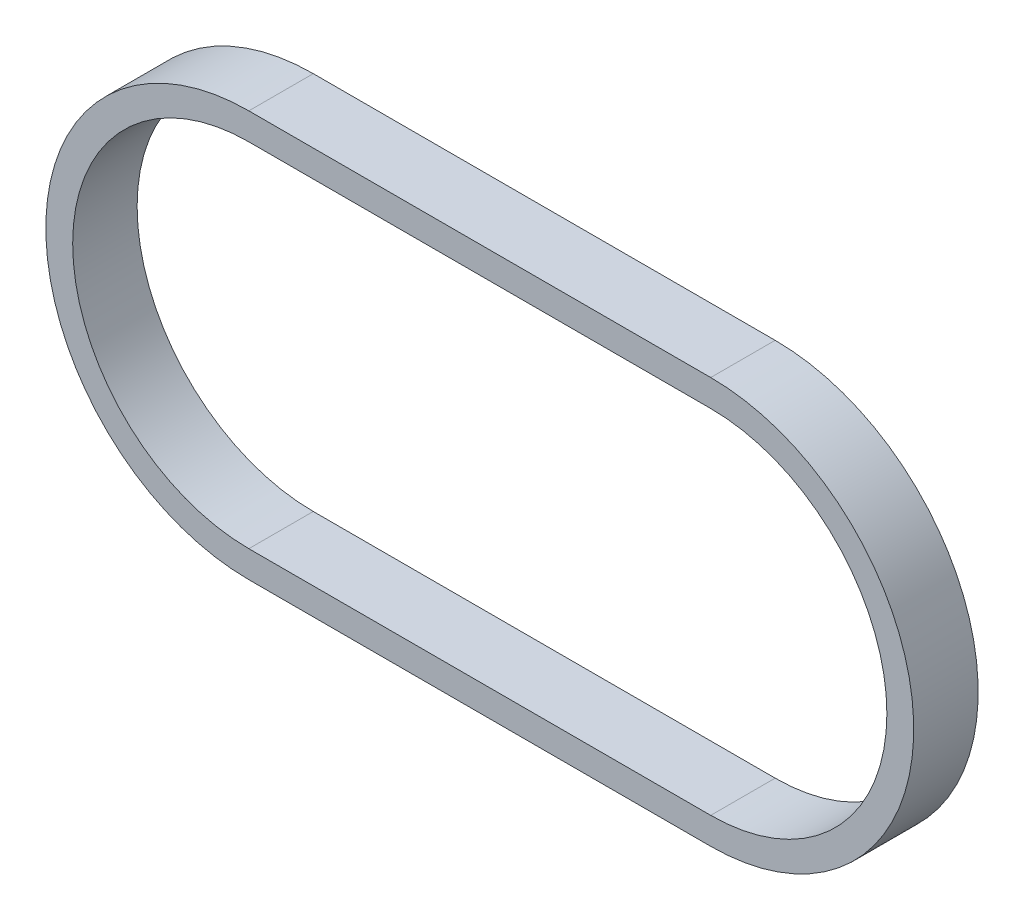
ISO-10303-21;
HEADER;
FILE_DESCRIPTION(('STEP AP214'),'2;1');
FILE_NAME('part.step','',(''),(''),'','','');
FILE_SCHEMA(('AUTOMOTIVE_DESIGN { 1 0 10303 214 1 1 1 1 }'));
ENDSEC;
DATA;
#1=APPLICATION_CONTEXT('core data for automotive mechanical design processes');
#2=APPLICATION_PROTOCOL_DEFINITION('international standard','automotive_design',2000,#1);
#3=PRODUCT_CONTEXT('',#1,'mechanical');
#4=PRODUCT('Part','Part','',(#3));
#5=PRODUCT_RELATED_PRODUCT_CATEGORY('part','',(#4));
#6=PRODUCT_DEFINITION_FORMATION('','',#4);
#7=PRODUCT_DEFINITION_CONTEXT('part definition',#1,'design');
#8=PRODUCT_DEFINITION('design','',#6,#7);
#9=PRODUCT_DEFINITION_SHAPE('','',#8);
#10=(LENGTH_UNIT() NAMED_UNIT(*) SI_UNIT(.MILLI.,.METRE.));
#11=(NAMED_UNIT(*) PLANE_ANGLE_UNIT() SI_UNIT($,.RADIAN.));
#12=(NAMED_UNIT(*) SI_UNIT($,.STERADIAN.) SOLID_ANGLE_UNIT());
#13=UNCERTAINTY_MEASURE_WITH_UNIT(LENGTH_MEASURE(1.E-05),#10,'distance_accuracy_value','');
#14=(GEOMETRIC_REPRESENTATION_CONTEXT(3) GLOBAL_UNCERTAINTY_ASSIGNED_CONTEXT((#13)) GLOBAL_UNIT_ASSIGNED_CONTEXT((#10,
#11,#12)) REPRESENTATION_CONTEXT('',''));
#15=CARTESIAN_POINT('',(0.,0.,0.));
#16=DIRECTION('',(0.,0.,1.));
#17=DIRECTION('',(1.,0.,0.));
#18=AXIS2_PLACEMENT_3D('',#15,#16,#17);
#19=CARTESIAN_POINT('',(-21.5,1.50133697570255E-13,6.));
#20=DIRECTION('',(0.,0.,1.));
#21=DIRECTION('',(1.,0.,0.));
#22=AXIS2_PLACEMENT_3D('',#19,#20,#21);
#23=PLANE('',#22);
#24=CARTESIAN_POINT('',(-21.5,1.50133697570255E-13,6.));
#25=DIRECTION('',(0.,0.,1.));
#26=DIRECTION('',(1.,0.,0.));
#27=AXIS2_PLACEMENT_3D('',#24,#25,#26);
#28=CIRCLE('',#27,18.9000000000001);
#29=CARTESIAN_POINT('',(-21.4999999999999,18.9000000000001,6.));
#30=VERTEX_POINT('',#29);
#31=CARTESIAN_POINT('',(-21.5,-18.9,6.));
#32=VERTEX_POINT('',#31);
#33=EDGE_CURVE('E153',#30,#32,#28,.T.);
#34=ORIENTED_EDGE('',*,*,#33,.T.);
#35=DIRECTION('',(1.,0.,0.));
#36=VECTOR('',#35,1.);
#37=CARTESIAN_POINT('',(-21.5,-18.9,6.));
#38=LINE('',#37,#36);
#39=CARTESIAN_POINT('',(21.5,-18.9,6.));
#40=VERTEX_POINT('',#39);
#41=EDGE_CURVE('E157',#32,#40,#38,.T.);
#42=ORIENTED_EDGE('',*,*,#41,.T.);
#43=CARTESIAN_POINT('',(21.5,0.,6.));
#44=DIRECTION('',(0.,0.,1.));
#45=DIRECTION('',(1.,0.,0.));
#46=AXIS2_PLACEMENT_3D('',#43,#44,#45);
#47=CIRCLE('',#46,18.9);
#48=CARTESIAN_POINT('',(21.5,18.9,6.));
#49=VERTEX_POINT('',#48);
#50=EDGE_CURVE('E161',#40,#49,#47,.T.);
#51=ORIENTED_EDGE('',*,*,#50,.T.);
#52=DIRECTION('',(-1.,0.,0.));
#53=VECTOR('',#52,1.);
#54=CARTESIAN_POINT('',(21.5,18.9,6.));
#55=LINE('',#54,#53);
#56=EDGE_CURVE('E164',#49,#30,#55,.T.);
#57=ORIENTED_EDGE('',*,*,#56,.T.);
#58=EDGE_LOOP('',(#34,#42,#51,#57));
#59=FACE_BOUND('',#58,.T.);
#60=DIRECTION('',(-1.,0.,0.));
#61=VECTOR('',#60,1.);
#62=CARTESIAN_POINT('',(-21.4999999999999,16.4000000000001,6.));
#63=LINE('',#62,#61);
#64=CARTESIAN_POINT('',(21.5,16.4,6.));
#65=VERTEX_POINT('',#64);
#66=CARTESIAN_POINT('',(-21.4999999999999,16.4000000000001,6.));
#67=VERTEX_POINT('',#66);
#68=EDGE_CURVE('E114',#65,#67,#63,.T.);
#69=ORIENTED_EDGE('',*,*,#68,.F.);
#70=CARTESIAN_POINT('',(21.5,0.,6.));
#71=DIRECTION('',(0.,0.,1.));
#72=DIRECTION('',(-1.,0.,0.));
#73=AXIS2_PLACEMENT_3D('',#70,#71,#72);
#74=CIRCLE('',#73,16.4);
#75=CARTESIAN_POINT('',(21.5,-16.4,6.));
#76=VERTEX_POINT('',#75);
#77=EDGE_CURVE('E105',#76,#65,#74,.T.);
#78=ORIENTED_EDGE('',*,*,#77,.F.);
#79=DIRECTION('',(1.,0.,0.));
#80=VECTOR('',#79,1.);
#81=CARTESIAN_POINT('',(21.5,-16.4,6.));
#82=LINE('',#81,#80);
#83=CARTESIAN_POINT('',(-21.5,-16.4,6.));
#84=VERTEX_POINT('',#83);
#85=EDGE_CURVE('E131',#84,#76,#82,.T.);
#86=ORIENTED_EDGE('',*,*,#85,.F.);
#87=CARTESIAN_POINT('',(-21.5,1.50133697570255E-13,6.));
#88=DIRECTION('',(0.,0.,1.));
#89=DIRECTION('',(-1.,0.,0.));
#90=AXIS2_PLACEMENT_3D('',#87,#88,#89);
#91=CIRCLE('',#90,16.4000000000001);
#92=EDGE_CURVE('E127',#67,#84,#91,.T.);
#93=ORIENTED_EDGE('',*,*,#92,.F.);
#94=EDGE_LOOP('',(#69,#78,#86,#93));
#95=FACE_BOUND('',#94,.T.);
#96=ADVANCED_FACE('F39',(#59,#95),#23,.T.);
#97=CARTESIAN_POINT('',(-21.5,1.50133697570255E-13,0.));
#98=DIRECTION('',(0.,0.,1.));
#99=DIRECTION('',(1.,0.,0.));
#100=AXIS2_PLACEMENT_3D('',#97,#98,#99);
#101=PLANE('',#100);
#102=CARTESIAN_POINT('',(-21.5,1.50133697570255E-13,0.));
#103=DIRECTION('',(0.,0.,1.));
#104=DIRECTION('',(1.,0.,0.));
#105=AXIS2_PLACEMENT_3D('',#102,#103,#104);
#106=CIRCLE('',#105,18.9000000000001);
#107=CARTESIAN_POINT('',(-21.4999999999999,18.9000000000001,0.));
#108=VERTEX_POINT('',#107);
#109=CARTESIAN_POINT('',(-21.5,-18.9,0.));
#110=VERTEX_POINT('',#109);
#111=EDGE_CURVE('E123',#108,#110,#106,.T.);
#112=ORIENTED_EDGE('',*,*,#111,.F.);
#113=DIRECTION('',(-1.,0.,0.));
#114=VECTOR('',#113,1.);
#115=CARTESIAN_POINT('',(21.5,18.9,0.));
#116=LINE('',#115,#114);
#117=CARTESIAN_POINT('',(21.5,18.9,0.));
#118=VERTEX_POINT('',#117);
#119=EDGE_CURVE('E158',#118,#108,#116,.T.);
#120=ORIENTED_EDGE('',*,*,#119,.F.);
#121=CARTESIAN_POINT('',(21.5,0.,0.));
#122=DIRECTION('',(0.,0.,1.));
#123=DIRECTION('',(1.,0.,0.));
#124=AXIS2_PLACEMENT_3D('',#121,#122,#123);
#125=CIRCLE('',#124,18.9);
#126=CARTESIAN_POINT('',(21.5,-18.9,0.));
#127=VERTEX_POINT('',#126);
#128=EDGE_CURVE('E174',#127,#118,#125,.T.);
#129=ORIENTED_EDGE('',*,*,#128,.F.);
#130=DIRECTION('',(1.,0.,0.));
#131=VECTOR('',#130,1.);
#132=CARTESIAN_POINT('',(-21.5,-18.9,0.));
#133=LINE('',#132,#131);
#134=EDGE_CURVE('E171',#110,#127,#133,.T.);
#135=ORIENTED_EDGE('',*,*,#134,.F.);
#136=EDGE_LOOP('',(#112,#120,#129,#135));
#137=FACE_BOUND('',#136,.T.);
#138=CARTESIAN_POINT('',(21.5,0.,0.));
#139=DIRECTION('',(0.,0.,1.));
#140=DIRECTION('',(-1.,0.,0.));
#141=AXIS2_PLACEMENT_3D('',#138,#139,#140);
#142=CIRCLE('',#141,16.4);
#143=CARTESIAN_POINT('',(21.5,-16.4,0.));
#144=VERTEX_POINT('',#143);
#145=CARTESIAN_POINT('',(21.5,16.4,0.));
#146=VERTEX_POINT('',#145);
#147=EDGE_CURVE('E63',#144,#146,#142,.T.);
#148=ORIENTED_EDGE('',*,*,#147,.T.);
#149=DIRECTION('',(-1.,0.,0.));
#150=VECTOR('',#149,1.);
#151=CARTESIAN_POINT('',(-21.4999999999999,16.4000000000001,0.));
#152=LINE('',#151,#150);
#153=CARTESIAN_POINT('',(-21.4999999999999,16.4000000000001,0.));
#154=VERTEX_POINT('',#153);
#155=EDGE_CURVE('E121',#146,#154,#152,.T.);
#156=ORIENTED_EDGE('',*,*,#155,.T.);
#157=CARTESIAN_POINT('',(-21.5,1.50133697570255E-13,0.));
#158=DIRECTION('',(0.,0.,1.));
#159=DIRECTION('',(-1.,0.,0.));
#160=AXIS2_PLACEMENT_3D('',#157,#158,#159);
#161=CIRCLE('',#160,16.4000000000001);
#162=CARTESIAN_POINT('',(-21.5,-16.3999999999999,0.));
#163=VERTEX_POINT('',#162);
#164=EDGE_CURVE('E140',#154,#163,#161,.T.);
#165=ORIENTED_EDGE('',*,*,#164,.T.);
#166=DIRECTION('',(1.,0.,0.));
#167=VECTOR('',#166,1.);
#168=CARTESIAN_POINT('',(21.5,-16.4,0.));
#169=LINE('',#168,#167);
#170=EDGE_CURVE('E115',#163,#144,#169,.T.);
#171=ORIENTED_EDGE('',*,*,#170,.T.);
#172=EDGE_LOOP('',(#148,#156,#165,#171));
#173=FACE_BOUND('',#172,.T.);
#174=ADVANCED_FACE('F197',(#137,#173),#101,.F.);
#175=CARTESIAN_POINT('',(-21.5,1.50133697570255E-13,6.));
#176=DIRECTION('',(0.,0.,-1.));
#177=DIRECTION('',(-1.,0.,0.));
#178=AXIS2_PLACEMENT_3D('',#175,#176,#177);
#179=CYLINDRICAL_SURFACE('',#178,18.9000000000001);
#180=ORIENTED_EDGE('',*,*,#111,.T.);
#181=DIRECTION('',(0.,0.,-1.));
#182=VECTOR('',#181,1.);
#183=CARTESIAN_POINT('',(-21.5,-18.9,6.));
#184=LINE('',#183,#182);
#185=EDGE_CURVE('E11',#32,#110,#184,.T.);
#186=ORIENTED_EDGE('',*,*,#185,.F.);
#187=ORIENTED_EDGE('',*,*,#33,.F.);
#188=DIRECTION('',(0.,0.,-1.));
#189=VECTOR('',#188,1.);
#190=CARTESIAN_POINT('',(-21.4999999999999,18.9000000000001,6.));
#191=LINE('',#190,#189);
#192=EDGE_CURVE('E167',#30,#108,#191,.T.);
#193=ORIENTED_EDGE('',*,*,#192,.T.);
#194=EDGE_LOOP('',(#180,#186,#187,#193));
#195=FACE_BOUND('',#194,.T.);
#196=ADVANCED_FACE('F41',(#195),#179,.T.);
#197=CARTESIAN_POINT('',(-21.5,-18.9,6.));
#198=DIRECTION('',(0.,1.,0.));
#199=DIRECTION('',(0.,0.,1.));
#200=AXIS2_PLACEMENT_3D('',#197,#198,#199);
#201=PLANE('',#200);
#202=ORIENTED_EDGE('',*,*,#134,.T.);
#203=DIRECTION('',(0.,0.,-1.));
#204=VECTOR('',#203,1.);
#205=CARTESIAN_POINT('',(21.5,-18.9,6.));
#206=LINE('',#205,#204);
#207=EDGE_CURVE('E48',#40,#127,#206,.T.);
#208=ORIENTED_EDGE('',*,*,#207,.F.);
#209=ORIENTED_EDGE('',*,*,#41,.F.);
#210=ORIENTED_EDGE('',*,*,#185,.T.);
#211=EDGE_LOOP('',(#202,#208,#209,#210));
#212=FACE_BOUND('',#211,.T.);
#213=ADVANCED_FACE('F207',(#212),#201,.F.);
#214=CARTESIAN_POINT('',(21.5,0.,6.));
#215=DIRECTION('',(0.,0.,-1.));
#216=DIRECTION('',(-1.,0.,0.));
#217=AXIS2_PLACEMENT_3D('',#214,#215,#216);
#218=CYLINDRICAL_SURFACE('',#217,18.9);
#219=ORIENTED_EDGE('',*,*,#128,.T.);
#220=DIRECTION('',(0.,0.,-1.));
#221=VECTOR('',#220,1.);
#222=CARTESIAN_POINT('',(21.5,18.9,6.));
#223=LINE('',#222,#221);
#224=EDGE_CURVE('E182',#49,#118,#223,.T.);
#225=ORIENTED_EDGE('',*,*,#224,.F.);
#226=ORIENTED_EDGE('',*,*,#50,.F.);
#227=ORIENTED_EDGE('',*,*,#207,.T.);
#228=EDGE_LOOP('',(#219,#225,#226,#227));
#229=FACE_BOUND('',#228,.T.);
#230=ADVANCED_FACE('F191',(#229),#218,.T.);
#231=CARTESIAN_POINT('',(21.5,18.9,6.));
#232=DIRECTION('',(0.,-1.,0.));
#233=DIRECTION('',(1.,0.,0.));
#234=AXIS2_PLACEMENT_3D('',#231,#232,#233);
#235=PLANE('',#234);
#236=ORIENTED_EDGE('',*,*,#119,.T.);
#237=ORIENTED_EDGE('',*,*,#192,.F.);
#238=ORIENTED_EDGE('',*,*,#56,.F.);
#239=ORIENTED_EDGE('',*,*,#224,.T.);
#240=EDGE_LOOP('',(#236,#237,#238,#239));
#241=FACE_BOUND('',#240,.T.);
#242=ADVANCED_FACE('F201',(#241),#235,.F.);
#243=CARTESIAN_POINT('',(21.5,0.,6.));
#244=DIRECTION('',(0.,0.,-1.));
#245=DIRECTION('',(-1.,0.,0.));
#246=AXIS2_PLACEMENT_3D('',#243,#244,#245);
#247=CYLINDRICAL_SURFACE('',#246,16.4);
#248=ORIENTED_EDGE('',*,*,#147,.F.);
#249=DIRECTION('',(0.,0.,-1.));
#250=VECTOR('',#249,1.);
#251=CARTESIAN_POINT('',(21.5,-16.4,6.));
#252=LINE('',#251,#250);
#253=EDGE_CURVE('E109',#76,#144,#252,.T.);
#254=ORIENTED_EDGE('',*,*,#253,.F.);
#255=ORIENTED_EDGE('',*,*,#77,.T.);
#256=DIRECTION('',(0.,0.,-1.));
#257=VECTOR('',#256,1.);
#258=CARTESIAN_POINT('',(21.5,16.4,6.));
#259=LINE('',#258,#257);
#260=EDGE_CURVE('E108',#65,#146,#259,.T.);
#261=ORIENTED_EDGE('',*,*,#260,.T.);
#262=EDGE_LOOP('',(#248,#254,#255,#261));
#263=FACE_BOUND('',#262,.T.);
#264=ADVANCED_FACE('F107',(#263),#247,.F.);
#265=CARTESIAN_POINT('',(-21.4999999999999,16.4000000000001,6.));
#266=DIRECTION('',(0.,-1.,0.));
#267=DIRECTION('',(1.,0.,0.));
#268=AXIS2_PLACEMENT_3D('',#265,#266,#267);
#269=PLANE('',#268);
#270=ORIENTED_EDGE('',*,*,#155,.F.);
#271=ORIENTED_EDGE('',*,*,#260,.F.);
#272=ORIENTED_EDGE('',*,*,#68,.T.);
#273=DIRECTION('',(0.,0.,-1.));
#274=VECTOR('',#273,1.);
#275=CARTESIAN_POINT('',(-21.4999999999999,16.4000000000001,6.));
#276=LINE('',#275,#274);
#277=EDGE_CURVE('E124',#67,#154,#276,.T.);
#278=ORIENTED_EDGE('',*,*,#277,.T.);
#279=EDGE_LOOP('',(#270,#271,#272,#278));
#280=FACE_BOUND('',#279,.T.);
#281=ADVANCED_FACE('F118',(#280),#269,.T.);
#282=CARTESIAN_POINT('',(-21.5,1.50133697570255E-13,6.));
#283=DIRECTION('',(0.,0.,-1.));
#284=DIRECTION('',(-1.,0.,0.));
#285=AXIS2_PLACEMENT_3D('',#282,#283,#284);
#286=CYLINDRICAL_SURFACE('',#285,16.4000000000001);
#287=ORIENTED_EDGE('',*,*,#164,.F.);
#288=ORIENTED_EDGE('',*,*,#277,.F.);
#289=ORIENTED_EDGE('',*,*,#92,.T.);
#290=DIRECTION('',(0.,0.,-1.));
#291=VECTOR('',#290,1.);
#292=CARTESIAN_POINT('',(-21.5,-16.3999999999999,6.));
#293=LINE('',#292,#291);
#294=EDGE_CURVE('E55',#84,#163,#293,.T.);
#295=ORIENTED_EDGE('',*,*,#294,.T.);
#296=EDGE_LOOP('',(#287,#288,#289,#295));
#297=FACE_BOUND('',#296,.T.);
#298=ADVANCED_FACE('F230',(#297),#286,.F.);
#299=CARTESIAN_POINT('',(21.5,-16.4,6.));
#300=DIRECTION('',(0.,1.,0.));
#301=DIRECTION('',(-1.,0.,0.));
#302=AXIS2_PLACEMENT_3D('',#299,#300,#301);
#303=PLANE('',#302);
#304=ORIENTED_EDGE('',*,*,#170,.F.);
#305=ORIENTED_EDGE('',*,*,#294,.F.);
#306=ORIENTED_EDGE('',*,*,#85,.T.);
#307=ORIENTED_EDGE('',*,*,#253,.T.);
#308=EDGE_LOOP('',(#304,#305,#306,#307));
#309=FACE_BOUND('',#308,.T.);
#310=ADVANCED_FACE('F234',(#309),#303,.T.);
#311=CLOSED_SHELL('',(#96,#174,#196,#213,#230,#242,#264,#281,#298,#310));
#312=MANIFOLD_SOLID_BREP('B2',#311);
#313=ADVANCED_BREP_SHAPE_REPRESENTATION('',(#18,#312),#14);
#314=SHAPE_DEFINITION_REPRESENTATION(#9,#313);
ENDSEC;
END-ISO-10303-21;
